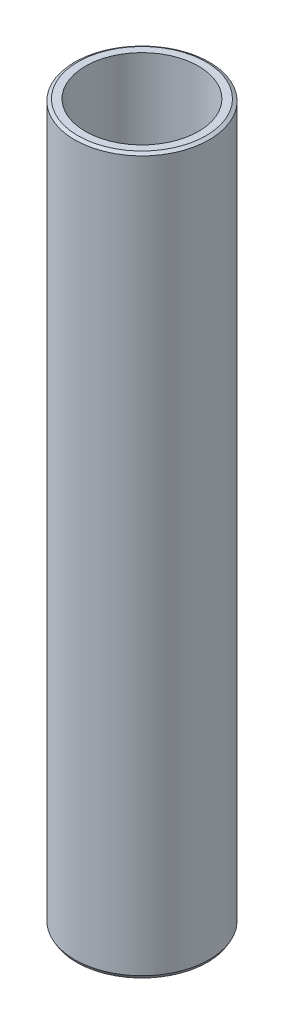
ISO-10303-21;
HEADER;
FILE_DESCRIPTION(('STEP AP214'),'2;1');
FILE_NAME('part.step','',(''),(''),'','','');
FILE_SCHEMA(('AUTOMOTIVE_DESIGN { 1 0 10303 214 1 1 1 1 }'));
ENDSEC;
DATA;
#1=APPLICATION_CONTEXT('core data for automotive mechanical design processes');
#2=APPLICATION_PROTOCOL_DEFINITION('international standard','automotive_design',2000,#1);
#3=PRODUCT_CONTEXT('',#1,'mechanical');
#4=PRODUCT('Part','Part','',(#3));
#5=PRODUCT_RELATED_PRODUCT_CATEGORY('part','',(#4));
#6=PRODUCT_DEFINITION_FORMATION('','',#4);
#7=PRODUCT_DEFINITION_CONTEXT('part definition',#1,'design');
#8=PRODUCT_DEFINITION('design','',#6,#7);
#9=PRODUCT_DEFINITION_SHAPE('','',#8);
#10=(LENGTH_UNIT() NAMED_UNIT(*) SI_UNIT(.MILLI.,.METRE.));
#11=(NAMED_UNIT(*) PLANE_ANGLE_UNIT() SI_UNIT($,.RADIAN.));
#12=(NAMED_UNIT(*) SI_UNIT($,.STERADIAN.) SOLID_ANGLE_UNIT());
#13=UNCERTAINTY_MEASURE_WITH_UNIT(LENGTH_MEASURE(1.E-05),#10,'distance_accuracy_value','');
#14=(GEOMETRIC_REPRESENTATION_CONTEXT(3) GLOBAL_UNCERTAINTY_ASSIGNED_CONTEXT((#13)) GLOBAL_UNIT_ASSIGNED_CONTEXT((#10,
#11,#12)) REPRESENTATION_CONTEXT('',''));
#15=CARTESIAN_POINT('',(0.,0.,0.));
#16=DIRECTION('',(0.,0.,1.));
#17=DIRECTION('',(1.,0.,0.));
#18=AXIS2_PLACEMENT_3D('',#15,#16,#17);
#19=CARTESIAN_POINT('',(0.,478.072123829045,0.));
#20=DIRECTION('',(0.,-1.,0.));
#21=DIRECTION('',(0.,0.,-1.));
#22=AXIS2_PLACEMENT_3D('',#19,#20,#21);
#23=CYLINDRICAL_SURFACE('',#22,45.);
#24=CARTESIAN_POINT('',(0.,476.805583874245,0.));
#25=DIRECTION('',(0.,1.,0.));
#26=DIRECTION('',(0.,0.,1.));
#27=AXIS2_PLACEMENT_3D('',#24,#25,#26);
#28=CIRCLE('',#27,45.);
#29=CARTESIAN_POINT('',(0.,476.805583874245,45.));
#30=VERTEX_POINT('',#29);
#31=EDGE_CURVE('E50',#30,#30,#28,.F.);
#32=ORIENTED_EDGE('',*,*,#31,.T.);
#33=EDGE_LOOP('',(#32));
#34=FACE_BOUND('',#33,.T.);
#35=CARTESIAN_POINT('',(0.,2.19371155152898,0.));
#36=DIRECTION('',(0.,1.,0.));
#37=DIRECTION('',(0.,0.,1.));
#38=AXIS2_PLACEMENT_3D('',#35,#36,#37);
#39=CIRCLE('',#38,45.);
#40=CARTESIAN_POINT('',(0.,2.19371155152898,45.));
#41=VERTEX_POINT('',#40);
#42=EDGE_CURVE('E51',#41,#41,#39,.T.);
#43=ORIENTED_EDGE('',*,*,#42,.T.);
#44=EDGE_LOOP('',(#43));
#45=FACE_BOUND('',#44,.T.);
#46=ADVANCED_FACE('F39',(#34,#45),#23,.T.);
#47=CARTESIAN_POINT('',(0.,478.072123829045,0.));
#48=DIRECTION('',(0.,1.,0.));
#49=DIRECTION('',(0.,0.,1.));
#50=AXIS2_PLACEMENT_3D('',#47,#48,#49);
#51=PLANE('',#50);
#52=CARTESIAN_POINT('',(0.,478.072123829045,0.));
#53=DIRECTION('',(0.,1.,0.));
#54=DIRECTION('',(0.,0.,1.));
#55=AXIS2_PLACEMENT_3D('',#52,#53,#54);
#56=CIRCLE('',#55,42.8062884484712);
#57=CARTESIAN_POINT('',(0.,478.072123829045,42.8062884484712));
#58=VERTEX_POINT('',#57);
#59=EDGE_CURVE('E54',#58,#58,#56,.T.);
#60=ORIENTED_EDGE('',*,*,#59,.T.);
#61=EDGE_LOOP('',(#60));
#62=FACE_BOUND('',#61,.T.);
#63=CARTESIAN_POINT('',(0.,478.072123829045,0.));
#64=DIRECTION('',(0.,1.,0.));
#65=DIRECTION('',(0.,0.,1.));
#66=AXIS2_PLACEMENT_3D('',#63,#64,#65);
#67=CIRCLE('',#66,37.8105716468204);
#68=CARTESIAN_POINT('',(0.,478.072123829045,37.8105716468204));
#69=VERTEX_POINT('',#68);
#70=EDGE_CURVE('E58',#69,#69,#67,.T.);
#71=ORIENTED_EDGE('',*,*,#70,.F.);
#72=EDGE_LOOP('',(#71));
#73=FACE_BOUND('',#72,.T.);
#74=ADVANCED_FACE('F69',(#62,#73),#51,.T.);
#75=CARTESIAN_POINT('',(0.,0.,0.));
#76=DIRECTION('',(0.,1.,0.));
#77=DIRECTION('',(0.,0.,1.));
#78=AXIS2_PLACEMENT_3D('',#75,#76,#77);
#79=PLANE('',#78);
#80=CARTESIAN_POINT('',(0.,0.,0.));
#81=DIRECTION('',(0.,1.,0.));
#82=DIRECTION('',(0.,0.,1.));
#83=AXIS2_PLACEMENT_3D('',#80,#81,#82);
#84=CIRCLE('',#83,43.7334600452003);
#85=CARTESIAN_POINT('',(0.,0.,43.7334600452003));
#86=VERTEX_POINT('',#85);
#87=EDGE_CURVE('E10',#86,#86,#84,.F.);
#88=ORIENTED_EDGE('',*,*,#87,.T.);
#89=EDGE_LOOP('',(#88));
#90=FACE_BOUND('',#89,.T.);
#91=CARTESIAN_POINT('',(0.,0.,0.));
#92=DIRECTION('',(0.,1.,0.));
#93=DIRECTION('',(0.,0.,1.));
#94=AXIS2_PLACEMENT_3D('',#91,#92,#93);
#95=CIRCLE('',#94,37.8105716468204);
#96=CARTESIAN_POINT('',(0.,0.,37.8105716468204));
#97=VERTEX_POINT('',#96);
#98=EDGE_CURVE('E63',#97,#97,#95,.T.);
#99=ORIENTED_EDGE('',*,*,#98,.T.);
#100=EDGE_LOOP('',(#99));
#101=FACE_BOUND('',#100,.T.);
#102=ADVANCED_FACE('F75',(#90,#101),#79,.F.);
#103=CARTESIAN_POINT('',(0.,478.072123829045,0.));
#104=DIRECTION('',(0.,-1.,0.));
#105=DIRECTION('',(0.,0.,-1.));
#106=AXIS2_PLACEMENT_3D('',#103,#104,#105);
#107=CYLINDRICAL_SURFACE('',#106,37.8105716468204);
#108=ORIENTED_EDGE('',*,*,#70,.T.);
#109=EDGE_LOOP('',(#108));
#110=FACE_BOUND('',#109,.T.);
#111=ORIENTED_EDGE('',*,*,#98,.F.);
#112=EDGE_LOOP('',(#111));
#113=FACE_BOUND('',#112,.T.);
#114=ADVANCED_FACE('F70',(#110,#113),#107,.F.);
#115=CARTESIAN_POINT('',(0.,478.072123829045,0.));
#116=DIRECTION('',(0.,-1.,0.));
#117=DIRECTION('',(0.,0.,-1.));
#118=AXIS2_PLACEMENT_3D('',#115,#116,#117);
#119=CONICAL_SURFACE('',#118,42.8062884484712,1.04719755119659);
#120=ORIENTED_EDGE('',*,*,#31,.F.);
#121=EDGE_LOOP('',(#120));
#122=FACE_BOUND('',#121,.T.);
#123=ORIENTED_EDGE('',*,*,#59,.F.);
#124=EDGE_LOOP('',(#123));
#125=FACE_BOUND('',#124,.T.);
#126=ADVANCED_FACE('F81',(#122,#125),#119,.T.);
#127=CARTESIAN_POINT('',(0.,2.19371155152898,0.));
#128=DIRECTION('',(0.,1.,0.));
#129=DIRECTION('',(0.,0.,1.));
#130=AXIS2_PLACEMENT_3D('',#127,#128,#129);
#131=CONICAL_SURFACE('',#130,45.,0.523598775598304);
#132=ORIENTED_EDGE('',*,*,#87,.F.);
#133=EDGE_LOOP('',(#132));
#134=FACE_BOUND('',#133,.T.);
#135=ORIENTED_EDGE('',*,*,#42,.F.);
#136=EDGE_LOOP('',(#135));
#137=FACE_BOUND('',#136,.T.);
#138=ADVANCED_FACE('F45',(#134,#137),#131,.T.);
#139=CLOSED_SHELL('',(#46,#74,#102,#114,#126,#138));
#140=MANIFOLD_SOLID_BREP('B2',#139);
#141=ADVANCED_BREP_SHAPE_REPRESENTATION('',(#18,#140),#14);
#142=SHAPE_DEFINITION_REPRESENTATION(#9,#141);
ENDSEC;
END-ISO-10303-21;
